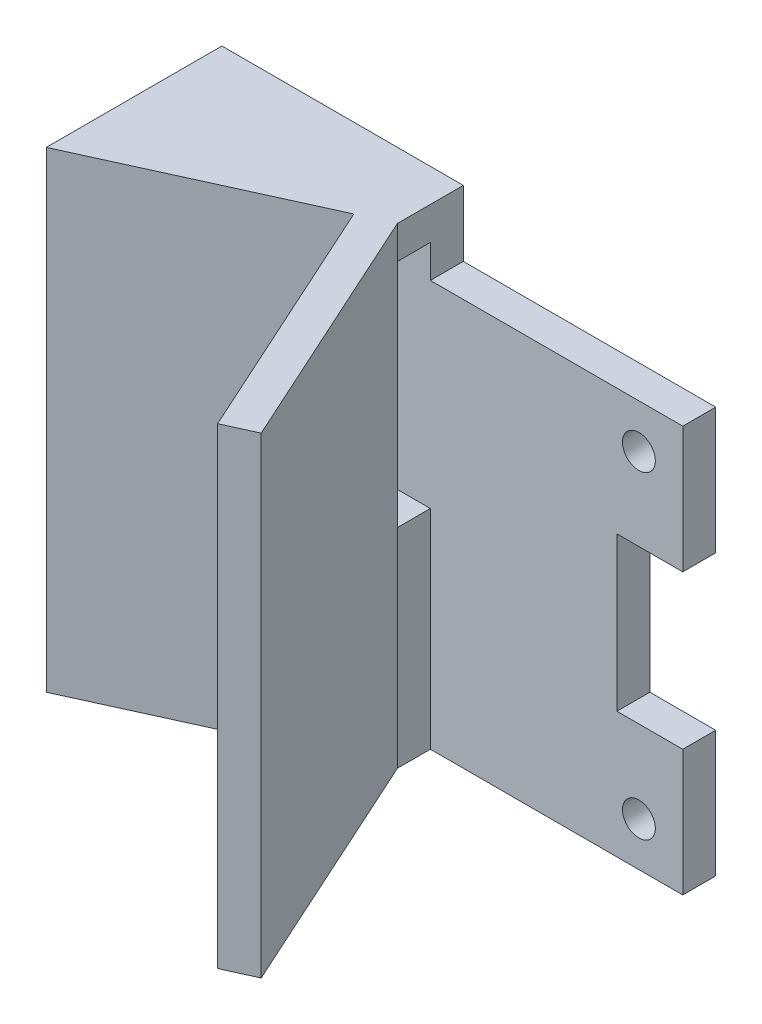
ISO-10303-21;
HEADER;
FILE_DESCRIPTION(('STEP AP214'),'2;1');
FILE_NAME('part.step','',(''),(''),'','','');
FILE_SCHEMA(('AUTOMOTIVE_DESIGN { 1 0 10303 214 1 1 1 1 }'));
ENDSEC;
DATA;
#1=APPLICATION_CONTEXT('core data for automotive mechanical design processes');
#2=APPLICATION_PROTOCOL_DEFINITION('international standard','automotive_design',2000,#1);
#3=PRODUCT_CONTEXT('',#1,'mechanical');
#4=PRODUCT('Part','Part','',(#3));
#5=PRODUCT_RELATED_PRODUCT_CATEGORY('part','',(#4));
#6=PRODUCT_DEFINITION_FORMATION('','',#4);
#7=PRODUCT_DEFINITION_CONTEXT('part definition',#1,'design');
#8=PRODUCT_DEFINITION('design','',#6,#7);
#9=PRODUCT_DEFINITION_SHAPE('','',#8);
#10=(LENGTH_UNIT() NAMED_UNIT(*) SI_UNIT(.MILLI.,.METRE.));
#11=(NAMED_UNIT(*) PLANE_ANGLE_UNIT() SI_UNIT($,.RADIAN.));
#12=(NAMED_UNIT(*) SI_UNIT($,.STERADIAN.) SOLID_ANGLE_UNIT());
#13=UNCERTAINTY_MEASURE_WITH_UNIT(LENGTH_MEASURE(1.E-05),#10,'distance_accuracy_value','');
#14=(GEOMETRIC_REPRESENTATION_CONTEXT(3) GLOBAL_UNCERTAINTY_ASSIGNED_CONTEXT((#13)) GLOBAL_UNIT_ASSIGNED_CONTEXT((#10,
#11,#12)) REPRESENTATION_CONTEXT('',''));
#15=CARTESIAN_POINT('',(0.,0.,0.));
#16=DIRECTION('',(0.,0.,1.));
#17=DIRECTION('',(1.,0.,0.));
#18=AXIS2_PLACEMENT_3D('',#15,#16,#17);
#19=CARTESIAN_POINT('',(-27.1973094170404,33.4618834080718,6.00205872907722));
#20=DIRECTION('',(-0.413732337220853,0.,-0.910398568286314));
#21=DIRECTION('',(-0.910398568286314,0.,0.413732337220853));
#22=AXIS2_PLACEMENT_3D('',#19,#20,#21);
#23=PLANE('',#22);
#24=DIRECTION('',(0.,-1.,0.));
#25=VECTOR('',#24,1.);
#26=CARTESIAN_POINT('',(-29.9285051218993,-3.53811659192824,7.24325574073978));
#27=LINE('',#26,#25);
#28=CARTESIAN_POINT('',(-29.9285051218993,39.4618834080718,7.24325574073977));
#29=VERTEX_POINT('',#28);
#30=CARTESIAN_POINT('',(-29.9285051218993,-3.53811659192824,7.24325574073978));
#31=VERTEX_POINT('',#30);
#32=EDGE_CURVE('E238',#29,#31,#27,.T.);
#33=ORIENTED_EDGE('',*,*,#32,.F.);
#34=DIRECTION('',(0.910398568286314,0.,-0.413732337220853));
#35=VECTOR('',#34,1.);
#36=CARTESIAN_POINT('',(-27.1973094170404,39.4618834080718,6.00205872907722));
#37=LINE('',#36,#35);
#38=CARTESIAN_POINT('',(-49.1973094170404,39.4618834080718,16.));
#39=VERTEX_POINT('',#38);
#40=EDGE_CURVE('E578',#39,#29,#37,.T.);
#41=ORIENTED_EDGE('',*,*,#40,.F.);
#42=DIRECTION('',(0.,-1.,0.));
#43=VECTOR('',#42,1.);
#44=CARTESIAN_POINT('',(-49.1973094170404,33.4618834080718,16.));
#45=LINE('',#44,#43);
#46=CARTESIAN_POINT('',(-49.1973094170404,-3.53811659192824,16.));
#47=VERTEX_POINT('',#46);
#48=EDGE_CURVE('E352',#39,#47,#45,.T.);
#49=ORIENTED_EDGE('',*,*,#48,.T.);
#50=DIRECTION('',(0.910398568286314,0.,-0.413732337220853));
#51=VECTOR('',#50,1.);
#52=CARTESIAN_POINT('',(-27.1973094170404,-3.53811659192824,6.00205872907722));
#53=LINE('',#52,#51);
#54=EDGE_CURVE('E583',#47,#31,#53,.T.);
#55=ORIENTED_EDGE('',*,*,#54,.T.);
#56=EDGE_LOOP('',(#33,#41,#49,#55));
#57=FACE_BOUND('',#56,.T.);
#58=ADVANCED_FACE('F35',(#57),#23,.F.);
#59=CARTESIAN_POINT('',(-27.1973094170404,33.4618834080718,16.));
#60=DIRECTION('',(-1.,0.,0.));
#61=DIRECTION('',(0.,-1.,0.));
#62=AXIS2_PLACEMENT_3D('',#59,#60,#61);
#63=PLANE('',#62);
#64=DIRECTION('',(0.,-1.,0.));
#65=VECTOR('',#64,1.);
#66=CARTESIAN_POINT('',(-27.1973094170404,33.4618834080718,6.00205872907722));
#67=LINE('',#66,#65);
#68=CARTESIAN_POINT('',(-27.1973094170404,39.4618834080718,6.00205872907722));
#69=VERTEX_POINT('',#68);
#70=CARTESIAN_POINT('',(-27.1973094170404,36.4618834080718,6.00205872907722));
#71=VERTEX_POINT('',#70);
#72=EDGE_CURVE('E242',#69,#71,#67,.T.);
#73=ORIENTED_EDGE('',*,*,#72,.T.);
#74=DIRECTION('',(0.,0.,1.));
#75=VECTOR('',#74,1.);
#76=CARTESIAN_POINT('',(-27.1973094170404,36.4618834080718,6.00205872907722));
#77=LINE('',#76,#75);
#78=CARTESIAN_POINT('',(-27.1973094170404,36.4618834080718,3.));
#79=VERTEX_POINT('',#78);
#80=EDGE_CURVE('E256',#79,#71,#77,.T.);
#81=ORIENTED_EDGE('',*,*,#80,.F.);
#82=DIRECTION('',(0.,1.,0.));
#83=VECTOR('',#82,1.);
#84=CARTESIAN_POINT('',(-27.1973094170404,15.4618834080718,3.));
#85=LINE('',#84,#83);
#86=CARTESIAN_POINT('',(-27.1973094170404,33.4618834080718,3.));
#87=VERTEX_POINT('',#86);
#88=EDGE_CURVE('E268',#87,#79,#85,.T.);
#89=ORIENTED_EDGE('',*,*,#88,.F.);
#90=DIRECTION('',(0.,0.,-1.));
#91=VECTOR('',#90,1.);
#92=CARTESIAN_POINT('',(-27.1973094170404,33.4618834080718,0.));
#93=LINE('',#92,#91);
#94=CARTESIAN_POINT('',(-27.1973094170404,33.4618834080718,0.));
#95=VERTEX_POINT('',#94);
#96=EDGE_CURVE('E281',#87,#95,#93,.T.);
#97=ORIENTED_EDGE('',*,*,#96,.T.);
#98=DIRECTION('',(0.,-1.,0.));
#99=VECTOR('',#98,1.);
#100=CARTESIAN_POINT('',(-27.1973094170404,39.4618834080718,0.));
#101=LINE('',#100,#99);
#102=CARTESIAN_POINT('',(-27.1973094170404,39.4618834080718,0.));
#103=VERTEX_POINT('',#102);
#104=EDGE_CURVE('E494',#103,#95,#101,.T.);
#105=ORIENTED_EDGE('',*,*,#104,.F.);
#106=DIRECTION('',(0.,0.,-1.));
#107=VECTOR('',#106,1.);
#108=CARTESIAN_POINT('',(-27.1973094170404,39.4618834080718,0.));
#109=LINE('',#108,#107);
#110=EDGE_CURVE('E569',#69,#103,#109,.T.);
#111=ORIENTED_EDGE('',*,*,#110,.F.);
#112=EDGE_LOOP('',(#73,#81,#89,#97,#105,#111));
#113=FACE_BOUND('',#112,.T.);
#114=ADVANCED_FACE('F498',(#113),#63,.F.);
#115=CARTESIAN_POINT('',(0.,33.4618834080718,3.));
#116=DIRECTION('',(0.,1.,0.));
#117=DIRECTION('',(0.,0.,1.));
#118=AXIS2_PLACEMENT_3D('',#115,#116,#117);
#119=PLANE('',#118);
#120=DIRECTION('',(1.,0.,0.));
#121=VECTOR('',#120,1.);
#122=CARTESIAN_POINT('',(0.,33.4618834080718,0.));
#123=LINE('',#122,#121);
#124=CARTESIAN_POINT('',(-4.19730941704035,33.4618834080718,0.));
#125=VERTEX_POINT('',#124);
#126=EDGE_CURVE('E61',#95,#125,#123,.T.);
#127=ORIENTED_EDGE('',*,*,#126,.F.);
#128=ORIENTED_EDGE('',*,*,#96,.F.);
#129=DIRECTION('',(1.,0.,0.));
#130=VECTOR('',#129,1.);
#131=CARTESIAN_POINT('',(0.,33.4618834080718,3.));
#132=LINE('',#131,#130);
#133=CARTESIAN_POINT('',(-4.19730941704035,33.4618834080718,3.));
#134=VERTEX_POINT('',#133);
#135=EDGE_CURVE('E459',#87,#134,#132,.T.);
#136=ORIENTED_EDGE('',*,*,#135,.T.);
#137=DIRECTION('',(0.,0.,-1.));
#138=VECTOR('',#137,1.);
#139=CARTESIAN_POINT('',(-4.19730941704035,33.4618834080718,3.));
#140=LINE('',#139,#138);
#141=EDGE_CURVE('E385',#134,#125,#140,.T.);
#142=ORIENTED_EDGE('',*,*,#141,.T.);
#143=EDGE_LOOP('',(#127,#128,#136,#142));
#144=FACE_BOUND('',#143,.T.);
#145=ADVANCED_FACE('F495',(#144),#119,.T.);
#146=CARTESIAN_POINT('',(-52.1973094170404,33.4618834080718,3.));
#147=VERTEX_POINT('',#146);
#148=CARTESIAN_POINT('',(-49.1973094170404,33.4618834080718,3.));
#149=VERTEX_POINT('',#148);
#150=EDGE_CURVE('E453',#147,#149,#132,.T.);
#151=ORIENTED_EDGE('',*,*,#150,.T.);
#152=DIRECTION('',(0.,0.,1.));
#153=VECTOR('',#152,1.);
#154=CARTESIAN_POINT('',(-49.1973094170404,33.4618834080718,16.));
#155=LINE('',#154,#153);
#156=CARTESIAN_POINT('',(-49.1973094170404,33.4618834080718,0.));
#157=VERTEX_POINT('',#156);
#158=EDGE_CURVE('E567',#157,#149,#155,.T.);
#159=ORIENTED_EDGE('',*,*,#158,.F.);
#160=CARTESIAN_POINT('',(-52.1973094170404,33.4618834080718,0.));
#161=VERTEX_POINT('',#160);
#162=EDGE_CURVE('E417',#161,#157,#123,.T.);
#163=ORIENTED_EDGE('',*,*,#162,.F.);
#164=DIRECTION('',(0.,0.,-1.));
#165=VECTOR('',#164,1.);
#166=CARTESIAN_POINT('',(-52.1973094170404,33.4618834080718,3.));
#167=LINE('',#166,#165);
#168=EDGE_CURVE('E387',#147,#161,#167,.T.);
#169=ORIENTED_EDGE('',*,*,#168,.F.);
#170=EDGE_LOOP('',(#151,#159,#163,#169));
#171=FACE_BOUND('',#170,.T.);
#172=ADVANCED_FACE('F497',(#171),#119,.T.);
#173=CARTESIAN_POINT('',(0.,0.,3.));
#174=DIRECTION('',(0.,0.,1.));
#175=DIRECTION('',(1.,0.,0.));
#176=AXIS2_PLACEMENT_3D('',#173,#174,#175);
#177=PLANE('',#176);
#178=DIRECTION('',(0.,-1.,0.));
#179=VECTOR('',#178,1.);
#180=CARTESIAN_POINT('',(-49.1973094170404,33.4618834080718,3.));
#181=LINE('',#180,#179);
#182=CARTESIAN_POINT('',(-49.1973094170404,4.96188340807176,3.));
#183=VERTEX_POINT('',#182);
#184=CARTESIAN_POINT('',(-49.1973094170404,-3.53811659192824,3.));
#185=VERTEX_POINT('',#184);
#186=EDGE_CURVE('E11',#183,#185,#181,.T.);
#187=ORIENTED_EDGE('',*,*,#186,.F.);
#188=DIRECTION('',(1.,0.,0.));
#189=VECTOR('',#188,1.);
#190=CARTESIAN_POINT('',(0.,4.96188340807172,3.));
#191=LINE('',#190,#189);
#192=CARTESIAN_POINT('',(-56.1973094170403,4.96188340807176,3.));
#193=VERTEX_POINT('',#192);
#194=EDGE_CURVE('E319',#193,#183,#191,.T.);
#195=ORIENTED_EDGE('',*,*,#194,.F.);
#196=DIRECTION('',(0.,-1.,0.));
#197=VECTOR('',#196,1.);
#198=CARTESIAN_POINT('',(-56.1973094170403,0.,3.));
#199=LINE('',#198,#197);
#200=CARTESIAN_POINT('',(-56.1973094170403,0.461883408071763,3.));
#201=VERTEX_POINT('',#200);
#202=EDGE_CURVE('E339',#193,#201,#199,.T.);
#203=ORIENTED_EDGE('',*,*,#202,.T.);
#204=CARTESIAN_POINT('',(-52.1915281295939,0.461883408071758,3.));
#205=DIRECTION('',(0.,0.,1.));
#206=DIRECTION('',(1.,0.,0.));
#207=AXIS2_PLACEMENT_3D('',#204,#205,#206);
#208=CIRCLE('',#207,4.00578128744645);
#209=CARTESIAN_POINT('',(-52.4066646510313,-3.53811659192824,3.));
#210=VERTEX_POINT('',#209);
#211=EDGE_CURVE('E359',#210,#201,#208,.F.);
#212=ORIENTED_EDGE('',*,*,#211,.F.);
#213=DIRECTION('',(1.,0.,0.));
#214=VECTOR('',#213,1.);
#215=CARTESIAN_POINT('',(0.,-3.53811659192824,3.));
#216=LINE('',#215,#214);
#217=EDGE_CURVE('E372',#210,#185,#216,.T.);
#218=ORIENTED_EDGE('',*,*,#217,.T.);
#219=EDGE_LOOP('',(#187,#195,#203,#212,#218));
#220=FACE_BOUND('',#219,.T.);
#221=CARTESIAN_POINT('',(-52.1915281295939,0.461883408071758,3.));
#222=DIRECTION('',(0.,0.,1.));
#223=DIRECTION('',(1.,0.,0.));
#224=AXIS2_PLACEMENT_3D('',#221,#222,#223);
#225=CIRCLE('',#224,1.5);
#226=CARTESIAN_POINT('',(-50.6915281295939,0.461883408071758,3.));
#227=VERTEX_POINT('',#226);
#228=EDGE_CURVE('E443',#227,#227,#225,.T.);
#229=ORIENTED_EDGE('',*,*,#228,.F.);
#230=EDGE_LOOP('',(#229));
#231=FACE_BOUND('',#230,.T.);
#232=ADVANCED_FACE('F504',(#220,#231),#177,.T.);
#233=CARTESIAN_POINT('',(-52.1915281295939,0.461883408071758,3.));
#234=DIRECTION('',(0.,0.,-1.));
#235=DIRECTION('',(-1.,0.,0.));
#236=AXIS2_PLACEMENT_3D('',#233,#234,#235);
#237=CYLINDRICAL_SURFACE('',#236,4.00578128744645);
#238=CARTESIAN_POINT('',(-52.1915281295939,0.461883408071758,0.));
#239=DIRECTION('',(0.,0.,1.));
#240=DIRECTION('',(1.,0.,0.));
#241=AXIS2_PLACEMENT_3D('',#238,#239,#240);
#242=CIRCLE('',#241,4.00578128744645);
#243=CARTESIAN_POINT('',(-52.4066646510313,-3.53811659192824,0.));
#244=VERTEX_POINT('',#243);
#245=CARTESIAN_POINT('',(-56.1973094170403,0.461883408071763,0.));
#246=VERTEX_POINT('',#245);
#247=EDGE_CURVE('E346',#244,#246,#242,.F.);
#248=ORIENTED_EDGE('',*,*,#247,.F.);
#249=DIRECTION('',(0.,0.,-1.));
#250=VECTOR('',#249,1.);
#251=CARTESIAN_POINT('',(-52.4066646510313,-3.53811659192824,3.));
#252=LINE('',#251,#250);
#253=EDGE_CURVE('E45',#210,#244,#252,.T.);
#254=ORIENTED_EDGE('',*,*,#253,.F.);
#255=ORIENTED_EDGE('',*,*,#211,.T.);
#256=DIRECTION('',(0.,0.,-1.));
#257=VECTOR('',#256,1.);
#258=CARTESIAN_POINT('',(-56.1973094170403,0.461883408071763,3.));
#259=LINE('',#258,#257);
#260=EDGE_CURVE('E391',#201,#246,#259,.T.);
#261=ORIENTED_EDGE('',*,*,#260,.T.);
#262=EDGE_LOOP('',(#248,#254,#255,#261));
#263=FACE_BOUND('',#262,.T.);
#264=ADVANCED_FACE('F37',(#263),#237,.T.);
#265=CARTESIAN_POINT('',(0.,-3.53811659192824,3.));
#266=DIRECTION('',(0.,1.,0.));
#267=DIRECTION('',(-1.,0.,0.));
#268=AXIS2_PLACEMENT_3D('',#265,#266,#267);
#269=PLANE('',#268);
#270=DIRECTION('',(0.,0.,-1.));
#271=VECTOR('',#270,1.);
#272=CARTESIAN_POINT('',(-27.1973094170404,-3.53811659192824,16.));
#273=LINE('',#272,#271);
#274=CARTESIAN_POINT('',(-27.1973094170404,-3.53811659192824,6.00205872907722));
#275=VERTEX_POINT('',#274);
#276=CARTESIAN_POINT('',(-27.1973094170404,-3.53811659192824,3.));
#277=VERTEX_POINT('',#276);
#278=EDGE_CURVE('E39',#275,#277,#273,.T.);
#279=ORIENTED_EDGE('',*,*,#278,.F.);
#280=DIRECTION('',(-0.413732337220853,0.,-0.910398568286314));
#281=VECTOR('',#280,1.);
#282=CARTESIAN_POINT('',(-16.854000986519,-3.53811659192824,28.7620229362351));
#283=LINE('',#282,#281);
#284=CARTESIAN_POINT('',(-16.854000986519,-3.53811659192824,28.7620229362351));
#285=VERTEX_POINT('',#284);
#286=EDGE_CURVE('E639',#285,#275,#283,.T.);
#287=ORIENTED_EDGE('',*,*,#286,.F.);
#288=DIRECTION('',(0.910398568286314,0.,-0.413732337220852));
#289=VECTOR('',#288,1.);
#290=CARTESIAN_POINT('',(-16.854000986519,-3.53811659192824,28.7620229362351));
#291=LINE('',#290,#289);
#292=CARTESIAN_POINT('',(-19.585196691378,-3.53811659192824,30.0032199478976));
#293=VERTEX_POINT('',#292);
#294=EDGE_CURVE('E235',#293,#285,#291,.T.);
#295=ORIENTED_EDGE('',*,*,#294,.F.);
#296=DIRECTION('',(-0.413732337220853,0.,-0.910398568286314));
#297=VECTOR('',#296,1.);
#298=CARTESIAN_POINT('',(-19.585196691378,-3.53811659192824,30.0032199478976));
#299=LINE('',#298,#297);
#300=EDGE_CURVE('E248',#293,#31,#299,.T.);
#301=ORIENTED_EDGE('',*,*,#300,.T.);
#302=ORIENTED_EDGE('',*,*,#54,.F.);
#303=DIRECTION('',(0.,0.,-1.));
#304=VECTOR('',#303,1.);
#305=CARTESIAN_POINT('',(-49.1973094170404,-3.53811659192824,16.));
#306=LINE('',#305,#304);
#307=EDGE_CURVE('E344',#47,#185,#306,.T.);
#308=ORIENTED_EDGE('',*,*,#307,.T.);
#309=ORIENTED_EDGE('',*,*,#217,.F.);
#310=ORIENTED_EDGE('',*,*,#253,.T.);
#311=DIRECTION('',(1.,0.,0.));
#312=VECTOR('',#311,1.);
#313=CARTESIAN_POINT('',(0.,-3.53811659192824,0.));
#314=LINE('',#313,#312);
#315=CARTESIAN_POINT('',(-4.19730941704035,-3.53811659192824,0.));
#316=VERTEX_POINT('',#315);
#317=EDGE_CURVE('E433',#244,#316,#314,.T.);
#318=ORIENTED_EDGE('',*,*,#317,.T.);
#319=DIRECTION('',(0.,0.,-1.));
#320=VECTOR('',#319,1.);
#321=CARTESIAN_POINT('',(-4.19730941704035,-3.53811659192824,3.));
#322=LINE('',#321,#320);
#323=CARTESIAN_POINT('',(-4.19730941704035,-3.53811659192824,3.));
#324=VERTEX_POINT('',#323);
#325=EDGE_CURVE('E375',#324,#316,#322,.T.);
#326=ORIENTED_EDGE('',*,*,#325,.F.);
#327=EDGE_CURVE('E362',#277,#324,#216,.T.);
#328=ORIENTED_EDGE('',*,*,#327,.F.);
#329=EDGE_LOOP('',(#279,#287,#295,#301,#302,#308,#309,#310,#318,#326,#328));
#330=FACE_BOUND('',#329,.T.);
#331=ADVANCED_FACE('F598',(#330),#269,.F.);
#332=CARTESIAN_POINT('',(-4.19730941704035,0.,3.));
#333=DIRECTION('',(1.,0.,0.));
#334=DIRECTION('',(0.,1.,0.));
#335=AXIS2_PLACEMENT_3D('',#332,#333,#334);
#336=PLANE('',#335);
#337=DIRECTION('',(0.,-1.,0.));
#338=VECTOR('',#337,1.);
#339=CARTESIAN_POINT('',(-4.19730941704035,0.,0.));
#340=LINE('',#339,#338);
#341=CARTESIAN_POINT('',(-4.19730941704035,7.96188340807176,0.));
#342=VERTEX_POINT('',#341);
#343=EDGE_CURVE('E430',#342,#316,#340,.T.);
#344=ORIENTED_EDGE('',*,*,#343,.F.);
#345=DIRECTION('',(0.,0.,-1.));
#346=VECTOR('',#345,1.);
#347=CARTESIAN_POINT('',(-4.19730941704035,7.96188340807176,3.));
#348=LINE('',#347,#346);
#349=CARTESIAN_POINT('',(-4.19730941704035,7.96188340807176,3.));
#350=VERTEX_POINT('',#349);
#351=EDGE_CURVE('E377',#350,#342,#348,.T.);
#352=ORIENTED_EDGE('',*,*,#351,.F.);
#353=DIRECTION('',(0.,-1.,0.));
#354=VECTOR('',#353,1.);
#355=CARTESIAN_POINT('',(-4.19730941704035,0.,3.));
#356=LINE('',#355,#354);
#357=EDGE_CURVE('E366',#350,#324,#356,.T.);
#358=ORIENTED_EDGE('',*,*,#357,.T.);
#359=ORIENTED_EDGE('',*,*,#325,.T.);
#360=EDGE_LOOP('',(#344,#352,#358,#359));
#361=FACE_BOUND('',#360,.T.);
#362=ADVANCED_FACE('F561',(#361),#336,.T.);
#363=CARTESIAN_POINT('',(0.,7.96188340807176,3.));
#364=DIRECTION('',(0.,-1.,0.));
#365=DIRECTION('',(0.,0.,-1.));
#366=AXIS2_PLACEMENT_3D('',#363,#364,#365);
#367=PLANE('',#366);
#368=DIRECTION('',(-1.,0.,0.));
#369=VECTOR('',#368,1.);
#370=CARTESIAN_POINT('',(0.,7.96188340807176,0.));
#371=LINE('',#370,#369);
#372=CARTESIAN_POINT('',(-10.1973094170404,7.96188340807176,0.));
#373=VERTEX_POINT('',#372);
#374=EDGE_CURVE('E427',#342,#373,#371,.T.);
#375=ORIENTED_EDGE('',*,*,#374,.T.);
#376=DIRECTION('',(0.,0.,-1.));
#377=VECTOR('',#376,1.);
#378=CARTESIAN_POINT('',(-10.1973094170404,7.96188340807176,3.));
#379=LINE('',#378,#377);
#380=CARTESIAN_POINT('',(-10.1973094170404,7.96188340807176,3.));
#381=VERTEX_POINT('',#380);
#382=EDGE_CURVE('E379',#381,#373,#379,.T.);
#383=ORIENTED_EDGE('',*,*,#382,.F.);
#384=DIRECTION('',(-1.,0.,0.));
#385=VECTOR('',#384,1.);
#386=CARTESIAN_POINT('',(0.,7.96188340807176,3.));
#387=LINE('',#386,#385);
#388=EDGE_CURVE('E472',#350,#381,#387,.T.);
#389=ORIENTED_EDGE('',*,*,#388,.F.);
#390=ORIENTED_EDGE('',*,*,#351,.T.);
#391=EDGE_LOOP('',(#375,#383,#389,#390));
#392=FACE_BOUND('',#391,.T.);
#393=ADVANCED_FACE('F604',(#392),#367,.F.);
#394=CARTESIAN_POINT('',(-10.1973094170404,0.,3.));
#395=DIRECTION('',(1.,0.,0.));
#396=DIRECTION('',(0.,0.,-1.));
#397=AXIS2_PLACEMENT_3D('',#394,#395,#396);
#398=PLANE('',#397);
#399=DIRECTION('',(0.,-1.,0.));
#400=VECTOR('',#399,1.);
#401=CARTESIAN_POINT('',(-10.1973094170404,0.,0.));
#402=LINE('',#401,#400);
#403=CARTESIAN_POINT('',(-10.1973094170404,21.9618834080718,0.));
#404=VERTEX_POINT('',#403);
#405=EDGE_CURVE('E424',#404,#373,#402,.T.);
#406=ORIENTED_EDGE('',*,*,#405,.F.);
#407=DIRECTION('',(0.,0.,-1.));
#408=VECTOR('',#407,1.);
#409=CARTESIAN_POINT('',(-10.1973094170404,21.9618834080718,3.));
#410=LINE('',#409,#408);
#411=CARTESIAN_POINT('',(-10.1973094170404,21.9618834080718,3.));
#412=VERTEX_POINT('',#411);
#413=EDGE_CURVE('E381',#412,#404,#410,.T.);
#414=ORIENTED_EDGE('',*,*,#413,.F.);
#415=DIRECTION('',(0.,-1.,0.));
#416=VECTOR('',#415,1.);
#417=CARTESIAN_POINT('',(-10.1973094170404,0.,3.));
#418=LINE('',#417,#416);
#419=EDGE_CURVE('E470',#412,#381,#418,.T.);
#420=ORIENTED_EDGE('',*,*,#419,.T.);
#421=ORIENTED_EDGE('',*,*,#382,.T.);
#422=EDGE_LOOP('',(#406,#414,#420,#421));
#423=FACE_BOUND('',#422,.T.);
#424=ADVANCED_FACE('F481',(#423),#398,.T.);
#425=CARTESIAN_POINT('',(0.,21.9618834080718,3.));
#426=DIRECTION('',(0.,-1.,0.));
#427=DIRECTION('',(0.,0.,-1.));
#428=AXIS2_PLACEMENT_3D('',#425,#426,#427);
#429=PLANE('',#428);
#430=DIRECTION('',(-1.,0.,0.));
#431=VECTOR('',#430,1.);
#432=CARTESIAN_POINT('',(0.,21.9618834080718,0.));
#433=LINE('',#432,#431);
#434=CARTESIAN_POINT('',(-4.19730941704035,21.9618834080718,0.));
#435=VERTEX_POINT('',#434);
#436=EDGE_CURVE('E420',#435,#404,#433,.T.);
#437=ORIENTED_EDGE('',*,*,#436,.F.);
#438=DIRECTION('',(0.,0.,-1.));
#439=VECTOR('',#438,1.);
#440=CARTESIAN_POINT('',(-4.19730941704035,21.9618834080718,3.));
#441=LINE('',#440,#439);
#442=CARTESIAN_POINT('',(-4.19730941704035,21.9618834080718,3.));
#443=VERTEX_POINT('',#442);
#444=EDGE_CURVE('E383',#443,#435,#441,.T.);
#445=ORIENTED_EDGE('',*,*,#444,.F.);
#446=DIRECTION('',(-1.,0.,0.));
#447=VECTOR('',#446,1.);
#448=CARTESIAN_POINT('',(0.,21.9618834080718,3.));
#449=LINE('',#448,#447);
#450=EDGE_CURVE('E456',#443,#412,#449,.T.);
#451=ORIENTED_EDGE('',*,*,#450,.T.);
#452=ORIENTED_EDGE('',*,*,#413,.T.);
#453=EDGE_LOOP('',(#437,#445,#451,#452));
#454=FACE_BOUND('',#453,.T.);
#455=ADVANCED_FACE('F485',(#454),#429,.T.);
#456=EDGE_CURVE('E423',#125,#435,#340,.T.);
#457=ORIENTED_EDGE('',*,*,#456,.F.);
#458=ORIENTED_EDGE('',*,*,#141,.F.);
#459=EDGE_CURVE('E463',#134,#443,#356,.T.);
#460=ORIENTED_EDGE('',*,*,#459,.T.);
#461=ORIENTED_EDGE('',*,*,#444,.T.);
#462=EDGE_LOOP('',(#457,#458,#460,#461));
#463=FACE_BOUND('',#462,.T.);
#464=ADVANCED_FACE('F488',(#463),#336,.T.);
#465=CARTESIAN_POINT('',(-52.1973094170404,29.4618834080718,3.));
#466=DIRECTION('',(0.,0.,-1.));
#467=DIRECTION('',(-1.,0.,0.));
#468=AXIS2_PLACEMENT_3D('',#465,#466,#467);
#469=CYLINDRICAL_SURFACE('',#468,4.);
#470=CARTESIAN_POINT('',(-52.1973094170404,29.4618834080718,0.));
#471=DIRECTION('',(0.,0.,1.));
#472=DIRECTION('',(1.,0.,0.));
#473=AXIS2_PLACEMENT_3D('',#470,#471,#472);
#474=CIRCLE('',#473,4.);
#475=CARTESIAN_POINT('',(-56.1973094170404,29.4618834080718,0.));
#476=VERTEX_POINT('',#475);
#477=EDGE_CURVE('E414',#476,#161,#474,.F.);
#478=ORIENTED_EDGE('',*,*,#477,.F.);
#479=DIRECTION('',(0.,0.,-1.));
#480=VECTOR('',#479,1.);
#481=CARTESIAN_POINT('',(-56.1973094170404,29.4618834080718,3.));
#482=LINE('',#481,#480);
#483=CARTESIAN_POINT('',(-56.1973094170404,29.4618834080718,3.));
#484=VERTEX_POINT('',#483);
#485=EDGE_CURVE('E327',#484,#476,#482,.T.);
#486=ORIENTED_EDGE('',*,*,#485,.F.);
#487=CARTESIAN_POINT('',(-52.1973094170404,29.4618834080718,3.));
#488=DIRECTION('',(0.,0.,1.));
#489=DIRECTION('',(1.,0.,0.));
#490=AXIS2_PLACEMENT_3D('',#487,#488,#489);
#491=CIRCLE('',#490,4.);
#492=EDGE_CURVE('E450',#484,#147,#491,.F.);
#493=ORIENTED_EDGE('',*,*,#492,.T.);
#494=ORIENTED_EDGE('',*,*,#168,.T.);
#495=EDGE_LOOP('',(#478,#486,#493,#494));
#496=FACE_BOUND('',#495,.T.);
#497=ADVANCED_FACE('F553',(#496),#469,.T.);
#498=CARTESIAN_POINT('',(-56.1973094170403,0.,3.));
#499=DIRECTION('',(1.,0.,0.));
#500=DIRECTION('',(0.,1.,0.));
#501=AXIS2_PLACEMENT_3D('',#498,#499,#500);
#502=PLANE('',#501);
#503=DIRECTION('',(0.,-1.,0.));
#504=VECTOR('',#503,1.);
#505=CARTESIAN_POINT('',(-56.1973094170403,0.,0.));
#506=LINE('',#505,#504);
#507=CARTESIAN_POINT('',(-56.1973094170404,24.9618834080718,0.));
#508=VERTEX_POINT('',#507);
#509=EDGE_CURVE('E412',#476,#508,#506,.T.);
#510=ORIENTED_EDGE('',*,*,#509,.T.);
#511=DIRECTION('',(0.,0.,-1.));
#512=VECTOR('',#511,1.);
#513=CARTESIAN_POINT('',(-56.1973094170404,24.9618834080718,3.));
#514=LINE('',#513,#512);
#515=CARTESIAN_POINT('',(-56.1973094170404,24.9618834080718,3.));
#516=VERTEX_POINT('',#515);
#517=EDGE_CURVE('E324',#516,#508,#514,.T.);
#518=ORIENTED_EDGE('',*,*,#517,.F.);
#519=EDGE_CURVE('E315',#484,#516,#199,.T.);
#520=ORIENTED_EDGE('',*,*,#519,.F.);
#521=ORIENTED_EDGE('',*,*,#485,.T.);
#522=EDGE_LOOP('',(#510,#518,#520,#521));
#523=FACE_BOUND('',#522,.T.);
#524=ADVANCED_FACE('F546',(#523),#502,.F.);
#525=CARTESIAN_POINT('',(0.,24.9618834080718,3.));
#526=DIRECTION('',(0.,1.,0.));
#527=DIRECTION('',(0.,0.,1.));
#528=AXIS2_PLACEMENT_3D('',#525,#526,#527);
#529=PLANE('',#528);
#530=DIRECTION('',(1.,0.,0.));
#531=VECTOR('',#530,1.);
#532=CARTESIAN_POINT('',(0.,24.9618834080718,0.));
#533=LINE('',#532,#531);
#534=CARTESIAN_POINT('',(-49.1973094170404,24.9618834080718,0.));
#535=VERTEX_POINT('',#534);
#536=EDGE_CURVE('E323',#508,#535,#533,.T.);
#537=ORIENTED_EDGE('',*,*,#536,.T.);
#538=DIRECTION('',(0.,0.,-1.));
#539=VECTOR('',#538,1.);
#540=CARTESIAN_POINT('',(-49.1973094170404,24.9618834080718,3.));
#541=LINE('',#540,#539);
#542=CARTESIAN_POINT('',(-49.1973094170404,24.9618834080718,3.));
#543=VERTEX_POINT('',#542);
#544=EDGE_CURVE('E307',#543,#535,#541,.T.);
#545=ORIENTED_EDGE('',*,*,#544,.F.);
#546=DIRECTION('',(1.,0.,0.));
#547=VECTOR('',#546,1.);
#548=CARTESIAN_POINT('',(0.,24.9618834080718,3.));
#549=LINE('',#548,#547);
#550=EDGE_CURVE('E310',#516,#543,#549,.T.);
#551=ORIENTED_EDGE('',*,*,#550,.F.);
#552=ORIENTED_EDGE('',*,*,#517,.T.);
#553=EDGE_LOOP('',(#537,#545,#551,#552));
#554=FACE_BOUND('',#553,.T.);
#555=ADVANCED_FACE('F321',(#554),#529,.F.);
#556=CARTESIAN_POINT('',(-49.1973094170404,0.,3.));
#557=DIRECTION('',(1.,0.,0.));
#558=DIRECTION('',(0.,0.,-1.));
#559=AXIS2_PLACEMENT_3D('',#556,#557,#558);
#560=PLANE('',#559);
#561=ORIENTED_EDGE('',*,*,#158,.T.);
#562=DIRECTION('',(0.,1.,0.));
#563=VECTOR('',#562,1.);
#564=CARTESIAN_POINT('',(-49.1973094170404,15.4618834080718,3.));
#565=LINE('',#564,#563);
#566=CARTESIAN_POINT('',(-49.1973094170404,36.4618834080718,3.));
#567=VERTEX_POINT('',#566);
#568=EDGE_CURVE('E259',#149,#567,#565,.T.);
#569=ORIENTED_EDGE('',*,*,#568,.T.);
#570=DIRECTION('',(0.,0.,1.));
#571=VECTOR('',#570,1.);
#572=CARTESIAN_POINT('',(-49.1973094170404,36.4618834080718,6.00205872907722));
#573=LINE('',#572,#571);
#574=CARTESIAN_POINT('',(-49.1973094170404,36.4618834080718,6.00205872907722));
#575=VERTEX_POINT('',#574);
#576=EDGE_CURVE('E262',#567,#575,#573,.T.);
#577=ORIENTED_EDGE('',*,*,#576,.T.);
#578=DIRECTION('',(0.,-1.,0.));
#579=VECTOR('',#578,1.);
#580=CARTESIAN_POINT('',(-49.1973094170404,15.4618834080718,6.00205872907722));
#581=LINE('',#580,#579);
#582=CARTESIAN_POINT('',(-49.1973094170404,15.4618834080718,6.00205872907722));
#583=VERTEX_POINT('',#582);
#584=EDGE_CURVE('E252',#575,#583,#581,.T.);
#585=ORIENTED_EDGE('',*,*,#584,.T.);
#586=DIRECTION('',(0.,0.,-1.));
#587=VECTOR('',#586,1.);
#588=CARTESIAN_POINT('',(-49.1973094170404,15.4618834080718,6.00205872907722));
#589=LINE('',#588,#587);
#590=CARTESIAN_POINT('',(-49.1973094170404,15.4618834080718,3.));
#591=VERTEX_POINT('',#590);
#592=EDGE_CURVE('E255',#583,#591,#589,.T.);
#593=ORIENTED_EDGE('',*,*,#592,.T.);
#594=EDGE_CURVE('E53',#591,#543,#565,.T.);
#595=ORIENTED_EDGE('',*,*,#594,.T.);
#596=ORIENTED_EDGE('',*,*,#544,.T.);
#597=DIRECTION('',(0.,-1.,0.));
#598=VECTOR('',#597,1.);
#599=CARTESIAN_POINT('',(-49.1973094170404,0.,0.));
#600=LINE('',#599,#598);
#601=CARTESIAN_POINT('',(-49.1973094170404,4.96188340807176,0.));
#602=VERTEX_POINT('',#601);
#603=EDGE_CURVE('E409',#535,#602,#600,.T.);
#604=ORIENTED_EDGE('',*,*,#603,.T.);
#605=DIRECTION('',(0.,0.,-1.));
#606=VECTOR('',#605,1.);
#607=CARTESIAN_POINT('',(-49.1973094170404,4.96188340807176,3.));
#608=LINE('',#607,#606);
#609=EDGE_CURVE('E325',#183,#602,#608,.T.);
#610=ORIENTED_EDGE('',*,*,#609,.F.);
#611=ORIENTED_EDGE('',*,*,#186,.T.);
#612=ORIENTED_EDGE('',*,*,#307,.F.);
#613=ORIENTED_EDGE('',*,*,#48,.F.);
#614=DIRECTION('',(0.,0.,1.));
#615=VECTOR('',#614,1.);
#616=CARTESIAN_POINT('',(-49.1973094170404,39.4618834080718,16.));
#617=LINE('',#616,#615);
#618=CARTESIAN_POINT('',(-49.1973094170404,39.4618834080718,0.));
#619=VERTEX_POINT('',#618);
#620=EDGE_CURVE('E584',#619,#39,#617,.T.);
#621=ORIENTED_EDGE('',*,*,#620,.F.);
#622=DIRECTION('',(0.,-1.,0.));
#623=VECTOR('',#622,1.);
#624=CARTESIAN_POINT('',(-49.1973094170404,39.4618834080718,0.));
#625=LINE('',#624,#623);
#626=EDGE_CURVE('E581',#619,#157,#625,.T.);
#627=ORIENTED_EDGE('',*,*,#626,.T.);
#628=EDGE_LOOP('',(#561,#569,#577,#585,#593,#595,#596,#604,#610,#611,#612,#613,#621,#627));
#629=FACE_BOUND('',#628,.T.);
#630=ADVANCED_FACE('F295',(#629),#560,.F.);
#631=CARTESIAN_POINT('',(0.,4.96188340807172,3.));
#632=DIRECTION('',(0.,1.,0.));
#633=DIRECTION('',(-1.,0.,0.));
#634=AXIS2_PLACEMENT_3D('',#631,#632,#633);
#635=PLANE('',#634);
#636=DIRECTION('',(1.,0.,0.));
#637=VECTOR('',#636,1.);
#638=CARTESIAN_POINT('',(0.,4.96188340807172,0.));
#639=LINE('',#638,#637);
#640=CARTESIAN_POINT('',(-56.1973094170403,4.96188340807176,0.));
#641=VERTEX_POINT('',#640);
#642=EDGE_CURVE('E406',#641,#602,#639,.T.);
#643=ORIENTED_EDGE('',*,*,#642,.F.);
#644=DIRECTION('',(0.,0.,-1.));
#645=VECTOR('',#644,1.);
#646=CARTESIAN_POINT('',(-56.1973094170403,4.96188340807176,3.));
#647=LINE('',#646,#645);
#648=EDGE_CURVE('E329',#193,#641,#647,.T.);
#649=ORIENTED_EDGE('',*,*,#648,.F.);
#650=ORIENTED_EDGE('',*,*,#194,.T.);
#651=ORIENTED_EDGE('',*,*,#609,.T.);
#652=EDGE_LOOP('',(#643,#649,#650,#651));
#653=FACE_BOUND('',#652,.T.);
#654=ADVANCED_FACE('F534',(#653),#635,.T.);
#655=CARTESIAN_POINT('',(-8.19730941704036,29.4618834080718,3.));
#656=DIRECTION('',(0.,0.,-1.));
#657=DIRECTION('',(-1.,0.,0.));
#658=AXIS2_PLACEMENT_3D('',#655,#656,#657);
#659=CYLINDRICAL_SURFACE('',#658,1.5);
#660=CARTESIAN_POINT('',(-8.19730941704036,29.4618834080718,3.));
#661=DIRECTION('',(0.,0.,1.));
#662=DIRECTION('',(1.,0.,0.));
#663=AXIS2_PLACEMENT_3D('',#660,#661,#662);
#664=CIRCLE('',#663,1.5);
#665=CARTESIAN_POINT('',(-6.69730941704036,29.4618834080718,3.));
#666=VERTEX_POINT('',#665);
#667=EDGE_CURVE('E440',#666,#666,#664,.T.);
#668=ORIENTED_EDGE('',*,*,#667,.T.);
#669=EDGE_LOOP('',(#668));
#670=FACE_BOUND('',#669,.T.);
#671=CARTESIAN_POINT('',(-8.19730941704036,29.4618834080718,0.));
#672=DIRECTION('',(0.,0.,1.));
#673=DIRECTION('',(1.,0.,0.));
#674=AXIS2_PLACEMENT_3D('',#671,#672,#673);
#675=CIRCLE('',#674,1.5);
#676=CARTESIAN_POINT('',(-6.69730941704036,29.4618834080718,0.));
#677=VERTEX_POINT('',#676);
#678=EDGE_CURVE('E396',#677,#677,#675,.T.);
#679=ORIENTED_EDGE('',*,*,#678,.F.);
#680=EDGE_LOOP('',(#679));
#681=FACE_BOUND('',#680,.T.);
#682=ADVANCED_FACE('F530',(#670,#681),#659,.F.);
#683=CARTESIAN_POINT('',(-52.1915281295939,0.461883408071758,3.));
#684=DIRECTION('',(0.,0.,-1.));
#685=DIRECTION('',(-1.,0.,0.));
#686=AXIS2_PLACEMENT_3D('',#683,#684,#685);
#687=CYLINDRICAL_SURFACE('',#686,1.5);
#688=ORIENTED_EDGE('',*,*,#228,.T.);
#689=EDGE_LOOP('',(#688));
#690=FACE_BOUND('',#689,.T.);
#691=CARTESIAN_POINT('',(-52.1915281295939,0.461883408071758,0.));
#692=DIRECTION('',(0.,0.,1.));
#693=DIRECTION('',(1.,0.,0.));
#694=AXIS2_PLACEMENT_3D('',#691,#692,#693);
#695=CIRCLE('',#694,1.5);
#696=CARTESIAN_POINT('',(-50.6915281295939,0.461883408071758,0.));
#697=VERTEX_POINT('',#696);
#698=EDGE_CURVE('E399',#697,#697,#695,.T.);
#699=ORIENTED_EDGE('',*,*,#698,.F.);
#700=EDGE_LOOP('',(#699));
#701=FACE_BOUND('',#700,.T.);
#702=ADVANCED_FACE('F533',(#690,#701),#687,.F.);
#703=CARTESIAN_POINT('',(-8.19730941704036,0.461883408071764,3.));
#704=DIRECTION('',(0.,0.,-1.));
#705=DIRECTION('',(-1.,0.,0.));
#706=AXIS2_PLACEMENT_3D('',#703,#704,#705);
#707=CYLINDRICAL_SURFACE('',#706,1.5);
#708=CARTESIAN_POINT('',(-8.19730941704036,0.461883408071764,3.));
#709=DIRECTION('',(0.,0.,1.));
#710=DIRECTION('',(1.,0.,0.));
#711=AXIS2_PLACEMENT_3D('',#708,#709,#710);
#712=CIRCLE('',#711,1.5);
#713=CARTESIAN_POINT('',(-6.69730941704036,0.461883408071764,3.));
#714=VERTEX_POINT('',#713);
#715=EDGE_CURVE('E446',#714,#714,#712,.T.);
#716=ORIENTED_EDGE('',*,*,#715,.T.);
#717=EDGE_LOOP('',(#716));
#718=FACE_BOUND('',#717,.T.);
#719=CARTESIAN_POINT('',(-8.19730941704036,0.461883408071764,0.));
#720=DIRECTION('',(0.,0.,1.));
#721=DIRECTION('',(1.,0.,0.));
#722=AXIS2_PLACEMENT_3D('',#719,#720,#721);
#723=CIRCLE('',#722,1.5);
#724=CARTESIAN_POINT('',(-6.69730941704036,0.461883408071764,0.));
#725=VERTEX_POINT('',#724);
#726=EDGE_CURVE('E402',#725,#725,#723,.T.);
#727=ORIENTED_EDGE('',*,*,#726,.F.);
#728=EDGE_LOOP('',(#727));
#729=FACE_BOUND('',#728,.T.);
#730=ADVANCED_FACE('F538',(#718,#729),#707,.F.);
#731=EDGE_CURVE('E405',#641,#246,#506,.T.);
#732=ORIENTED_EDGE('',*,*,#731,.T.);
#733=ORIENTED_EDGE('',*,*,#260,.F.);
#734=ORIENTED_EDGE('',*,*,#202,.F.);
#735=ORIENTED_EDGE('',*,*,#648,.T.);
#736=EDGE_LOOP('',(#732,#733,#734,#735));
#737=FACE_BOUND('',#736,.T.);
#738=ADVANCED_FACE('F528',(#737),#502,.F.);
#739=CARTESIAN_POINT('',(-52.1973094170404,29.4618834080718,3.));
#740=DIRECTION('',(0.,0.,-1.));
#741=DIRECTION('',(-1.,0.,0.));
#742=AXIS2_PLACEMENT_3D('',#739,#740,#741);
#743=CYLINDRICAL_SURFACE('',#742,1.5);
#744=CARTESIAN_POINT('',(-52.1973094170404,29.4618834080718,3.));
#745=DIRECTION('',(0.,0.,1.));
#746=DIRECTION('',(1.,0.,0.));
#747=AXIS2_PLACEMENT_3D('',#744,#745,#746);
#748=CIRCLE('',#747,1.5);
#749=CARTESIAN_POINT('',(-50.6973094170404,29.4618834080718,3.));
#750=VERTEX_POINT('',#749);
#751=EDGE_CURVE('E393',#750,#750,#748,.T.);
#752=ORIENTED_EDGE('',*,*,#751,.T.);
#753=EDGE_LOOP('',(#752));
#754=FACE_BOUND('',#753,.T.);
#755=CARTESIAN_POINT('',(-52.1973094170404,29.4618834080718,0.));
#756=DIRECTION('',(0.,0.,1.));
#757=DIRECTION('',(1.,0.,0.));
#758=AXIS2_PLACEMENT_3D('',#755,#756,#757);
#759=CIRCLE('',#758,1.5);
#760=CARTESIAN_POINT('',(-50.6973094170404,29.4618834080718,0.));
#761=VERTEX_POINT('',#760);
#762=EDGE_CURVE('E363',#761,#761,#759,.T.);
#763=ORIENTED_EDGE('',*,*,#762,.F.);
#764=EDGE_LOOP('',(#763));
#765=FACE_BOUND('',#764,.T.);
#766=ADVANCED_FACE('F523',(#754,#765),#743,.F.);
#767=DIRECTION('',(0.,1.,0.));
#768=VECTOR('',#767,1.);
#769=CARTESIAN_POINT('',(-27.1973094170404,33.4618834080718,3.));
#770=LINE('',#769,#768);
#771=CARTESIAN_POINT('',(-27.1973094170404,15.4618834080718,3.));
#772=VERTEX_POINT('',#771);
#773=EDGE_CURVE('E349',#277,#772,#770,.T.);
#774=ORIENTED_EDGE('',*,*,#773,.F.);
#775=ORIENTED_EDGE('',*,*,#327,.T.);
#776=ORIENTED_EDGE('',*,*,#357,.F.);
#777=ORIENTED_EDGE('',*,*,#388,.T.);
#778=ORIENTED_EDGE('',*,*,#419,.F.);
#779=ORIENTED_EDGE('',*,*,#450,.F.);
#780=ORIENTED_EDGE('',*,*,#459,.F.);
#781=ORIENTED_EDGE('',*,*,#135,.F.);
#782=ORIENTED_EDGE('',*,*,#88,.T.);
#783=DIRECTION('',(1.,0.,0.));
#784=VECTOR('',#783,1.);
#785=CARTESIAN_POINT('',(-49.1973094170404,36.4618834080718,3.));
#786=LINE('',#785,#784);
#787=EDGE_CURVE('E282',#567,#79,#786,.T.);
#788=ORIENTED_EDGE('',*,*,#787,.F.);
#789=ORIENTED_EDGE('',*,*,#568,.F.);
#790=ORIENTED_EDGE('',*,*,#150,.F.);
#791=ORIENTED_EDGE('',*,*,#492,.F.);
#792=ORIENTED_EDGE('',*,*,#519,.T.);
#793=ORIENTED_EDGE('',*,*,#550,.T.);
#794=ORIENTED_EDGE('',*,*,#594,.F.);
#795=DIRECTION('',(1.,0.,0.));
#796=VECTOR('',#795,1.);
#797=CARTESIAN_POINT('',(-49.1973094170404,15.4618834080718,3.));
#798=LINE('',#797,#796);
#799=EDGE_CURVE('E284',#591,#772,#798,.T.);
#800=ORIENTED_EDGE('',*,*,#799,.T.);
#801=EDGE_LOOP('',(#774,#775,#776,#777,#778,#779,#780,#781,#782,#788,#789,#790,#791,#792,#793,
#794,#800));
#802=FACE_BOUND('',#801,.T.);
#803=ORIENTED_EDGE('',*,*,#715,.F.);
#804=EDGE_LOOP('',(#803));
#805=FACE_BOUND('',#804,.T.);
#806=ORIENTED_EDGE('',*,*,#667,.F.);
#807=EDGE_LOOP('',(#806));
#808=FACE_BOUND('',#807,.T.);
#809=ORIENTED_EDGE('',*,*,#751,.F.);
#810=EDGE_LOOP('',(#809));
#811=FACE_BOUND('',#810,.T.);
#812=ADVANCED_FACE('F311',(#802,#805,#808,#811),#177,.T.);
#813=CARTESIAN_POINT('',(0.,0.,0.));
#814=DIRECTION('',(0.,0.,1.));
#815=DIRECTION('',(1.,0.,0.));
#816=AXIS2_PLACEMENT_3D('',#813,#814,#815);
#817=PLANE('',#816);
#818=ORIENTED_EDGE('',*,*,#247,.T.);
#819=ORIENTED_EDGE('',*,*,#731,.F.);
#820=ORIENTED_EDGE('',*,*,#642,.T.);
#821=ORIENTED_EDGE('',*,*,#603,.F.);
#822=ORIENTED_EDGE('',*,*,#536,.F.);
#823=ORIENTED_EDGE('',*,*,#509,.F.);
#824=ORIENTED_EDGE('',*,*,#477,.T.);
#825=ORIENTED_EDGE('',*,*,#162,.T.);
#826=ORIENTED_EDGE('',*,*,#626,.F.);
#827=DIRECTION('',(-1.,0.,0.));
#828=VECTOR('',#827,1.);
#829=CARTESIAN_POINT('',(-49.1973094170404,39.4618834080718,0.));
#830=LINE('',#829,#828);
#831=EDGE_CURVE('E587',#103,#619,#830,.T.);
#832=ORIENTED_EDGE('',*,*,#831,.F.);
#833=ORIENTED_EDGE('',*,*,#104,.T.);
#834=ORIENTED_EDGE('',*,*,#126,.T.);
#835=ORIENTED_EDGE('',*,*,#456,.T.);
#836=ORIENTED_EDGE('',*,*,#436,.T.);
#837=ORIENTED_EDGE('',*,*,#405,.T.);
#838=ORIENTED_EDGE('',*,*,#374,.F.);
#839=ORIENTED_EDGE('',*,*,#343,.T.);
#840=ORIENTED_EDGE('',*,*,#317,.F.);
#841=EDGE_LOOP('',(#818,#819,#820,#821,#822,#823,#824,#825,#826,#832,#833,#834,#835,#836,#837,
#838,#839,#840));
#842=FACE_BOUND('',#841,.T.);
#843=ORIENTED_EDGE('',*,*,#726,.T.);
#844=EDGE_LOOP('',(#843));
#845=FACE_BOUND('',#844,.T.);
#846=ORIENTED_EDGE('',*,*,#698,.T.);
#847=EDGE_LOOP('',(#846));
#848=FACE_BOUND('',#847,.T.);
#849=ORIENTED_EDGE('',*,*,#678,.T.);
#850=EDGE_LOOP('',(#849));
#851=FACE_BOUND('',#850,.T.);
#852=ORIENTED_EDGE('',*,*,#762,.T.);
#853=EDGE_LOOP('',(#852));
#854=FACE_BOUND('',#853,.T.);
#855=ADVANCED_FACE('F491',(#842,#845,#848,#851,#854),#817,.F.);
#856=ORIENTED_EDGE('',*,*,#773,.T.);
#857=DIRECTION('',(0.,0.,-1.));
#858=VECTOR('',#857,1.);
#859=CARTESIAN_POINT('',(-27.1973094170404,15.4618834080718,6.00205872907722));
#860=LINE('',#859,#858);
#861=CARTESIAN_POINT('',(-27.1973094170404,15.4618834080718,6.00205872907722));
#862=VERTEX_POINT('',#861);
#863=EDGE_CURVE('E246',#862,#772,#860,.T.);
#864=ORIENTED_EDGE('',*,*,#863,.F.);
#865=EDGE_CURVE('E589',#862,#275,#67,.T.);
#866=ORIENTED_EDGE('',*,*,#865,.T.);
#867=ORIENTED_EDGE('',*,*,#278,.T.);
#868=EDGE_LOOP('',(#856,#864,#866,#867));
#869=FACE_BOUND('',#868,.T.);
#870=ADVANCED_FACE('F507',(#869),#63,.F.);
#871=CARTESIAN_POINT('',(0.,39.4618834080718,0.));
#872=DIRECTION('',(0.,1.,0.));
#873=DIRECTION('',(0.,0.,1.));
#874=AXIS2_PLACEMENT_3D('',#871,#872,#873);
#875=PLANE('',#874);
#876=ORIENTED_EDGE('',*,*,#110,.T.);
#877=ORIENTED_EDGE('',*,*,#831,.T.);
#878=ORIENTED_EDGE('',*,*,#620,.T.);
#879=ORIENTED_EDGE('',*,*,#40,.T.);
#880=DIRECTION('',(-0.413732337220853,0.,-0.910398568286314));
#881=VECTOR('',#880,1.);
#882=CARTESIAN_POINT('',(-19.585196691378,39.4618834080718,30.0032199478976));
#883=LINE('',#882,#881);
#884=CARTESIAN_POINT('',(-19.585196691378,39.4618834080718,30.0032199478976));
#885=VERTEX_POINT('',#884);
#886=EDGE_CURVE('E226',#885,#29,#883,.T.);
#887=ORIENTED_EDGE('',*,*,#886,.F.);
#888=DIRECTION('',(-0.910398568286314,0.,0.413732337220852));
#889=VECTOR('',#888,1.);
#890=CARTESIAN_POINT('',(-16.854000986519,39.4618834080718,28.7620229362351));
#891=LINE('',#890,#889);
#892=CARTESIAN_POINT('',(-16.854000986519,39.4618834080718,28.7620229362351));
#893=VERTEX_POINT('',#892);
#894=EDGE_CURVE('E218',#893,#885,#891,.T.);
#895=ORIENTED_EDGE('',*,*,#894,.F.);
#896=DIRECTION('',(-0.413732337220853,0.,-0.910398568286314));
#897=VECTOR('',#896,1.);
#898=CARTESIAN_POINT('',(-16.854000986519,39.4618834080718,28.7620229362351));
#899=LINE('',#898,#897);
#900=EDGE_CURVE('E223',#893,#69,#899,.T.);
#901=ORIENTED_EDGE('',*,*,#900,.T.);
#902=EDGE_LOOP('',(#876,#877,#878,#879,#887,#895,#901));
#903=FACE_BOUND('',#902,.T.);
#904=ADVANCED_FACE('F221',(#903),#875,.T.);
#905=CARTESIAN_POINT('',(-49.1973094170404,15.4618834080718,6.00205872907722));
#906=DIRECTION('',(0.,0.,1.));
#907=DIRECTION('',(1.,0.,0.));
#908=AXIS2_PLACEMENT_3D('',#905,#906,#907);
#909=PLANE('',#908);
#910=DIRECTION('',(0.,-1.,0.));
#911=VECTOR('',#910,1.);
#912=CARTESIAN_POINT('',(-27.1973094170404,15.4618834080718,6.00205872907722));
#913=LINE('',#912,#911);
#914=EDGE_CURVE('E243',#71,#862,#913,.T.);
#915=ORIENTED_EDGE('',*,*,#914,.T.);
#916=DIRECTION('',(1.,0.,0.));
#917=VECTOR('',#916,1.);
#918=CARTESIAN_POINT('',(-49.1973094170404,15.4618834080718,6.00205872907722));
#919=LINE('',#918,#917);
#920=EDGE_CURVE('E271',#583,#862,#919,.T.);
#921=ORIENTED_EDGE('',*,*,#920,.F.);
#922=ORIENTED_EDGE('',*,*,#584,.F.);
#923=DIRECTION('',(1.,0.,0.));
#924=VECTOR('',#923,1.);
#925=CARTESIAN_POINT('',(-49.1973094170404,36.4618834080718,6.00205872907722));
#926=LINE('',#925,#924);
#927=EDGE_CURVE('E278',#575,#71,#926,.T.);
#928=ORIENTED_EDGE('',*,*,#927,.T.);
#929=EDGE_LOOP('',(#915,#921,#922,#928));
#930=FACE_BOUND('',#929,.T.);
#931=ADVANCED_FACE('F301',(#930),#909,.F.);
#932=CARTESIAN_POINT('',(-49.1973094170404,36.4618834080718,6.00205872907722));
#933=DIRECTION('',(0.,1.,0.));
#934=DIRECTION('',(-1.,0.,0.));
#935=AXIS2_PLACEMENT_3D('',#932,#933,#934);
#936=PLANE('',#935);
#937=ORIENTED_EDGE('',*,*,#80,.T.);
#938=ORIENTED_EDGE('',*,*,#927,.F.);
#939=ORIENTED_EDGE('',*,*,#576,.F.);
#940=ORIENTED_EDGE('',*,*,#787,.T.);
#941=EDGE_LOOP('',(#937,#938,#939,#940));
#942=FACE_BOUND('',#941,.T.);
#943=ADVANCED_FACE('F298',(#942),#936,.F.);
#944=CARTESIAN_POINT('',(-49.1973094170404,15.4618834080718,6.00205872907722));
#945=DIRECTION('',(0.,-1.,0.));
#946=DIRECTION('',(1.,0.,0.));
#947=AXIS2_PLACEMENT_3D('',#944,#945,#946);
#948=PLANE('',#947);
#949=ORIENTED_EDGE('',*,*,#863,.T.);
#950=ORIENTED_EDGE('',*,*,#799,.F.);
#951=ORIENTED_EDGE('',*,*,#592,.F.);
#952=ORIENTED_EDGE('',*,*,#920,.T.);
#953=EDGE_LOOP('',(#949,#950,#951,#952));
#954=FACE_BOUND('',#953,.T.);
#955=ADVANCED_FACE('F303',(#954),#948,.F.);
#956=CARTESIAN_POINT('',(-16.854000986519,-3.53811659192824,28.7620229362351));
#957=DIRECTION('',(-0.910398568286314,0.,0.413732337220853));
#958=DIRECTION('',(0.413732337220853,0.,0.910398568286314));
#959=AXIS2_PLACEMENT_3D('',#956,#957,#958);
#960=PLANE('',#959);
#961=ORIENTED_EDGE('',*,*,#865,.F.);
#962=ORIENTED_EDGE('',*,*,#914,.F.);
#963=ORIENTED_EDGE('',*,*,#72,.F.);
#964=ORIENTED_EDGE('',*,*,#900,.F.);
#965=DIRECTION('',(0.,1.,0.));
#966=VECTOR('',#965,1.);
#967=CARTESIAN_POINT('',(-16.854000986519,-3.53811659192824,28.7620229362351));
#968=LINE('',#967,#966);
#969=EDGE_CURVE('E230',#285,#893,#968,.T.);
#970=ORIENTED_EDGE('',*,*,#969,.F.);
#971=ORIENTED_EDGE('',*,*,#286,.T.);
#972=EDGE_LOOP('',(#961,#962,#963,#964,#970,#971));
#973=FACE_BOUND('',#972,.T.);
#974=ADVANCED_FACE('F240',(#973),#960,.F.);
#975=CARTESIAN_POINT('',(-19.585196691378,-3.53811659192824,30.0032199478976));
#976=DIRECTION('',(0.910398568286314,0.,-0.413732337220853));
#977=DIRECTION('',(-0.413732337220853,0.,-0.910398568286314));
#978=AXIS2_PLACEMENT_3D('',#975,#976,#977);
#979=PLANE('',#978);
#980=ORIENTED_EDGE('',*,*,#32,.T.);
#981=ORIENTED_EDGE('',*,*,#300,.F.);
#982=DIRECTION('',(0.,-1.,0.));
#983=VECTOR('',#982,1.);
#984=CARTESIAN_POINT('',(-19.585196691378,-3.53811659192824,30.0032199478976));
#985=LINE('',#984,#983);
#986=EDGE_CURVE('E229',#885,#293,#985,.T.);
#987=ORIENTED_EDGE('',*,*,#986,.F.);
#988=ORIENTED_EDGE('',*,*,#886,.T.);
#989=EDGE_LOOP('',(#980,#981,#987,#988));
#990=FACE_BOUND('',#989,.T.);
#991=ADVANCED_FACE('F640',(#990),#979,.F.);
#992=CARTESIAN_POINT('',(7.94856744330333,0.,17.4904491848984));
#993=DIRECTION('',(0.413732337220852,0.,0.910398568286314));
#994=DIRECTION('',(0.910398568286314,0.,-0.413732337220852));
#995=AXIS2_PLACEMENT_3D('',#992,#993,#994);
#996=PLANE('',#995);
#997=ORIENTED_EDGE('',*,*,#969,.T.);
#998=ORIENTED_EDGE('',*,*,#894,.T.);
#999=ORIENTED_EDGE('',*,*,#986,.T.);
#1000=ORIENTED_EDGE('',*,*,#294,.T.);
#1001=EDGE_LOOP('',(#997,#998,#999,#1000));
#1002=FACE_BOUND('',#1001,.T.);
#1003=ADVANCED_FACE('F233',(#1002),#996,.T.);
#1004=CLOSED_SHELL('',(#58,#114,#145,#172,#232,#264,#331,#362,#393,#424,#455,#464,#497,#524,
#555,#630,#654,#682,#702,#730,#738,#766,#812,#855,#870,#904,#931,#943,#955,#974,#991,#1003));
#1005=MANIFOLD_SOLID_BREP('B2',#1004);
#1006=ADVANCED_BREP_SHAPE_REPRESENTATION('',(#18,#1005),#14);
#1007=SHAPE_DEFINITION_REPRESENTATION(#9,#1006);
ENDSEC;
END-ISO-10303-21;
